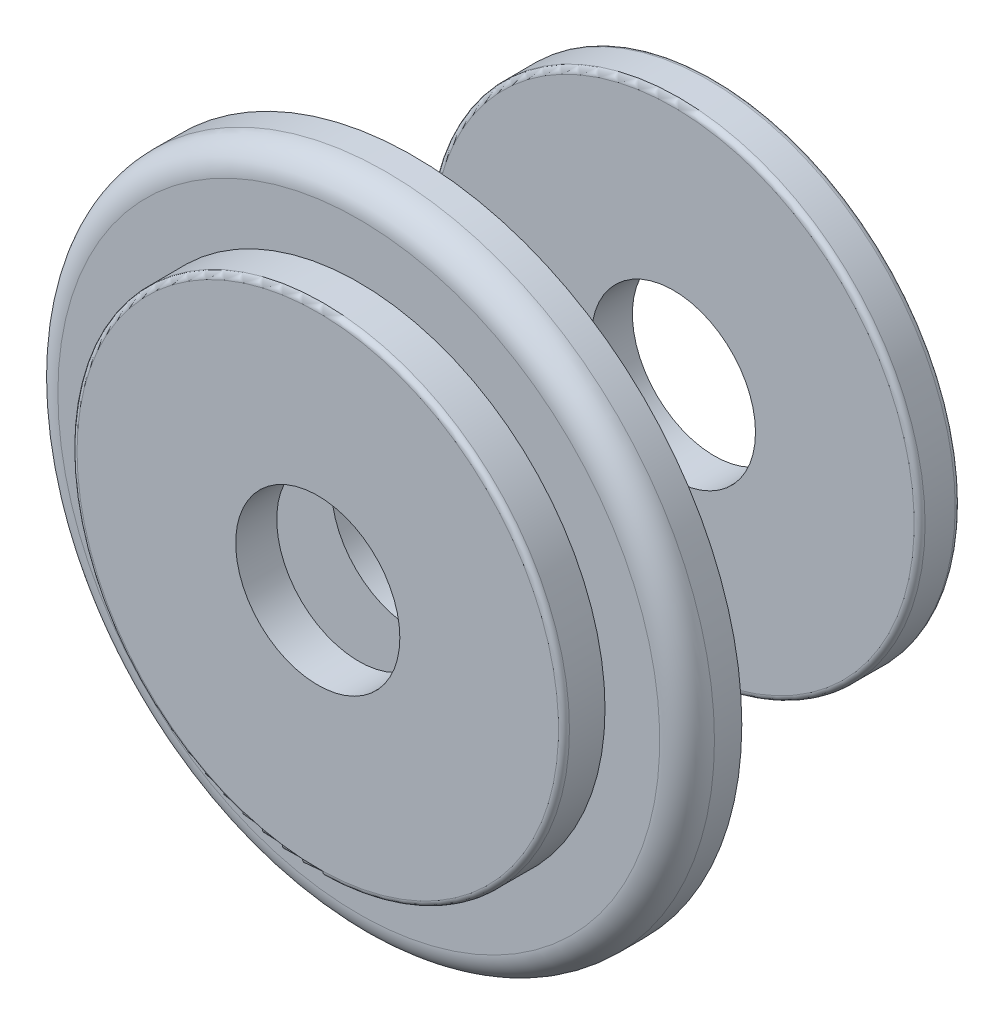
ISO-10303-21;
HEADER;
FILE_DESCRIPTION(('STEP AP214'),'2;1');
FILE_NAME('part.step','',(''),(''),'','','');
FILE_SCHEMA(('AUTOMOTIVE_DESIGN { 1 0 10303 214 1 1 1 1 }'));
ENDSEC;
DATA;
#1=APPLICATION_CONTEXT('core data for automotive mechanical design processes');
#2=APPLICATION_PROTOCOL_DEFINITION('international standard','automotive_design',2000,#1);
#3=PRODUCT_CONTEXT('',#1,'mechanical');
#4=PRODUCT('Part','Part','',(#3));
#5=PRODUCT_RELATED_PRODUCT_CATEGORY('part','',(#4));
#6=PRODUCT_DEFINITION_FORMATION('','',#4);
#7=PRODUCT_DEFINITION_CONTEXT('part definition',#1,'design');
#8=PRODUCT_DEFINITION('design','',#6,#7);
#9=PRODUCT_DEFINITION_SHAPE('','',#8);
#10=(LENGTH_UNIT() NAMED_UNIT(*) SI_UNIT(.MILLI.,.METRE.));
#11=(NAMED_UNIT(*) PLANE_ANGLE_UNIT() SI_UNIT($,.RADIAN.));
#12=(NAMED_UNIT(*) SI_UNIT($,.STERADIAN.) SOLID_ANGLE_UNIT());
#13=UNCERTAINTY_MEASURE_WITH_UNIT(LENGTH_MEASURE(1.E-05),#10,'distance_accuracy_value','');
#14=(GEOMETRIC_REPRESENTATION_CONTEXT(3) GLOBAL_UNCERTAINTY_ASSIGNED_CONTEXT((#13)) GLOBAL_UNIT_ASSIGNED_CONTEXT((#10,
#11,#12)) REPRESENTATION_CONTEXT('',''));
#15=CARTESIAN_POINT('',(0.,0.,0.));
#16=DIRECTION('',(0.,0.,1.));
#17=DIRECTION('',(1.,0.,0.));
#18=AXIS2_PLACEMENT_3D('',#15,#16,#17);
#19=CARTESIAN_POINT('',(0.,0.,20.5));
#20=DIRECTION('',(0.,0.,1.));
#21=DIRECTION('',(1.,0.,0.));
#22=AXIS2_PLACEMENT_3D('',#19,#20,#21);
#23=CYLINDRICAL_SURFACE('',#22,1.5);
#24=CARTESIAN_POINT('',(0.,0.,-4.75));
#25=DIRECTION('',(0.,0.,1.));
#26=DIRECTION('',(1.,0.,0.));
#27=AXIS2_PLACEMENT_3D('',#24,#25,#26);
#28=CIRCLE('',#27,1.5);
#29=CARTESIAN_POINT('',(1.5,0.,-4.75));
#30=VERTEX_POINT('',#29);
#31=EDGE_CURVE('E64',#30,#30,#28,.T.);
#32=ORIENTED_EDGE('',*,*,#31,.F.);
#33=EDGE_LOOP('',(#32));
#34=FACE_BOUND('',#33,.T.);
#35=CARTESIAN_POINT('',(0.,0.,-4.));
#36=DIRECTION('',(0.,0.,1.));
#37=DIRECTION('',(1.,0.,0.));
#38=AXIS2_PLACEMENT_3D('',#35,#36,#37);
#39=CIRCLE('',#38,1.5);
#40=CARTESIAN_POINT('',(1.5,0.,-4.));
#41=VERTEX_POINT('',#40);
#42=EDGE_CURVE('E61',#41,#41,#39,.T.);
#43=ORIENTED_EDGE('',*,*,#42,.T.);
#44=EDGE_LOOP('',(#43));
#45=FACE_BOUND('',#44,.T.);
#46=ADVANCED_FACE('F41',(#34,#45),#23,.F.);
#47=CARTESIAN_POINT('',(0.,1.5,-4.));
#48=DIRECTION('',(0.,0.,-1.));
#49=DIRECTION('',(-1.,0.,0.));
#50=AXIS2_PLACEMENT_3D('',#47,#48,#49);
#51=PLANE('',#50);
#52=CARTESIAN_POINT('',(0.,0.,-4.));
#53=DIRECTION('',(0.,0.,-1.));
#54=DIRECTION('',(-1.,0.,0.));
#55=AXIS2_PLACEMENT_3D('',#52,#53,#54);
#56=CIRCLE('',#55,4.4);
#57=CARTESIAN_POINT('',(-4.4,0.,-4.));
#58=VERTEX_POINT('',#57);
#59=EDGE_CURVE('E11',#58,#58,#56,.F.);
#60=ORIENTED_EDGE('',*,*,#59,.T.);
#61=EDGE_LOOP('',(#60));
#62=FACE_BOUND('',#61,.T.);
#63=ORIENTED_EDGE('',*,*,#42,.F.);
#64=EDGE_LOOP('',(#63));
#65=FACE_BOUND('',#64,.T.);
#66=ADVANCED_FACE('F72',(#62,#65),#51,.F.);
#67=CARTESIAN_POINT('',(0.,0.,20.5));
#68=DIRECTION('',(0.,0.,1.));
#69=DIRECTION('',(1.,0.,0.));
#70=AXIS2_PLACEMENT_3D('',#67,#68,#69);
#71=CYLINDRICAL_SURFACE('',#70,4.5);
#72=CARTESIAN_POINT('',(0.,0.,-4.65));
#73=DIRECTION('',(0.,0.,1.));
#74=DIRECTION('',(1.,0.,0.));
#75=AXIS2_PLACEMENT_3D('',#72,#73,#74);
#76=CIRCLE('',#75,4.5);
#77=CARTESIAN_POINT('',(4.5,0.,-4.65));
#78=VERTEX_POINT('',#77);
#79=EDGE_CURVE('E52',#78,#78,#76,.T.);
#80=ORIENTED_EDGE('',*,*,#79,.T.);
#81=EDGE_LOOP('',(#80));
#82=FACE_BOUND('',#81,.T.);
#83=CARTESIAN_POINT('',(0.,0.,-4.1));
#84=DIRECTION('',(0.,0.,-1.));
#85=DIRECTION('',(-1.,0.,0.));
#86=AXIS2_PLACEMENT_3D('',#83,#84,#85);
#87=CIRCLE('',#86,4.5);
#88=CARTESIAN_POINT('',(-4.5,0.,-4.1));
#89=VERTEX_POINT('',#88);
#90=EDGE_CURVE('E56',#89,#89,#87,.T.);
#91=ORIENTED_EDGE('',*,*,#90,.T.);
#92=EDGE_LOOP('',(#91));
#93=FACE_BOUND('',#92,.T.);
#94=ADVANCED_FACE('F77',(#82,#93),#71,.T.);
#95=CARTESIAN_POINT('',(0.,4.5,-4.75));
#96=DIRECTION('',(0.,0.,1.));
#97=DIRECTION('',(1.,0.,0.));
#98=AXIS2_PLACEMENT_3D('',#95,#96,#97);
#99=PLANE('',#98);
#100=CARTESIAN_POINT('',(0.,0.,-4.75));
#101=DIRECTION('',(0.,0.,1.));
#102=DIRECTION('',(1.,0.,0.));
#103=AXIS2_PLACEMENT_3D('',#100,#101,#102);
#104=CIRCLE('',#103,4.4);
#105=CARTESIAN_POINT('',(4.4,0.,-4.75));
#106=VERTEX_POINT('',#105);
#107=EDGE_CURVE('E48',#106,#106,#104,.F.);
#108=ORIENTED_EDGE('',*,*,#107,.T.);
#109=EDGE_LOOP('',(#108));
#110=FACE_BOUND('',#109,.T.);
#111=ORIENTED_EDGE('',*,*,#31,.T.);
#112=EDGE_LOOP('',(#111));
#113=FACE_BOUND('',#112,.T.);
#114=ADVANCED_FACE('F68',(#110,#113),#99,.F.);
#115=CARTESIAN_POINT('',(0.,0.,-4.65));
#116=DIRECTION('',(0.,0.,1.));
#117=DIRECTION('',(1.,0.,0.));
#118=AXIS2_PLACEMENT_3D('',#115,#116,#117);
#119=TOROIDAL_SURFACE('',#118,4.4,0.1);
#120=ORIENTED_EDGE('',*,*,#107,.F.);
#121=EDGE_LOOP('',(#120));
#122=FACE_BOUND('',#121,.T.);
#123=ORIENTED_EDGE('',*,*,#79,.F.);
#124=EDGE_LOOP('',(#123));
#125=FACE_BOUND('',#124,.T.);
#126=ADVANCED_FACE('F86',(#122,#125),#119,.T.);
#127=CARTESIAN_POINT('',(0.,0.,-4.1));
#128=DIRECTION('',(0.,0.,-1.));
#129=DIRECTION('',(-1.,0.,0.));
#130=AXIS2_PLACEMENT_3D('',#127,#128,#129);
#131=TOROIDAL_SURFACE('',#130,4.4,0.1);
#132=ORIENTED_EDGE('',*,*,#90,.F.);
#133=EDGE_LOOP('',(#132));
#134=FACE_BOUND('',#133,.T.);
#135=ORIENTED_EDGE('',*,*,#59,.F.);
#136=EDGE_LOOP('',(#135));
#137=FACE_BOUND('',#136,.T.);
#138=ADVANCED_FACE('F43',(#134,#137),#131,.T.);
#139=CLOSED_SHELL('',(#46,#66,#94,#114,#126,#138));
#140=MANIFOLD_SOLID_BREP('B2',#139);
#141=CARTESIAN_POINT('',(0.,4.5,0.));
#142=DIRECTION('',(0.,0.,1.));
#143=DIRECTION('',(1.,0.,0.));
#144=AXIS2_PLACEMENT_3D('',#141,#142,#143);
#145=PLANE('',#144);
#146=CARTESIAN_POINT('',(0.,0.,0.));
#147=DIRECTION('',(0.,0.,1.));
#148=DIRECTION('',(1.,0.,0.));
#149=AXIS2_PLACEMENT_3D('',#146,#147,#148);
#150=CIRCLE('',#149,4.4);
#151=CARTESIAN_POINT('',(4.4,0.,0.));
#152=VERTEX_POINT('',#151);
#153=EDGE_CURVE('E143',#152,#152,#150,.F.);
#154=ORIENTED_EDGE('',*,*,#153,.T.);
#155=EDGE_LOOP('',(#154));
#156=FACE_BOUND('',#155,.T.);
#157=CARTESIAN_POINT('',(0.,0.,0.));
#158=DIRECTION('',(0.,0.,1.));
#159=DIRECTION('',(1.,0.,0.));
#160=AXIS2_PLACEMENT_3D('',#157,#158,#159);
#161=CIRCLE('',#160,1.5);
#162=CARTESIAN_POINT('',(1.5,0.,0.));
#163=VERTEX_POINT('',#162);
#164=EDGE_CURVE('E158',#163,#163,#161,.T.);
#165=ORIENTED_EDGE('',*,*,#164,.T.);
#166=EDGE_LOOP('',(#165));
#167=FACE_BOUND('',#166,.T.);
#168=ADVANCED_FACE('F132',(#156,#167),#145,.F.);
#169=CARTESIAN_POINT('',(0.,0.,20.5));
#170=DIRECTION('',(0.,0.,1.));
#171=DIRECTION('',(1.,0.,0.));
#172=AXIS2_PLACEMENT_3D('',#169,#170,#171);
#173=CYLINDRICAL_SURFACE('',#172,1.5);
#174=ORIENTED_EDGE('',*,*,#164,.F.);
#175=EDGE_LOOP('',(#174));
#176=FACE_BOUND('',#175,.T.);
#177=CARTESIAN_POINT('',(0.,0.,0.750000000000001));
#178=DIRECTION('',(0.,0.,1.));
#179=DIRECTION('',(1.,0.,0.));
#180=AXIS2_PLACEMENT_3D('',#177,#178,#179);
#181=CIRCLE('',#180,1.5);
#182=CARTESIAN_POINT('',(1.5,0.,0.750000000000001));
#183=VERTEX_POINT('',#182);
#184=EDGE_CURVE('E161',#183,#183,#181,.T.);
#185=ORIENTED_EDGE('',*,*,#184,.T.);
#186=EDGE_LOOP('',(#185));
#187=FACE_BOUND('',#186,.T.);
#188=ADVANCED_FACE('F206',(#176,#187),#173,.F.);
#189=CARTESIAN_POINT('',(0.,1.5,0.750000000000001));
#190=DIRECTION('',(0.,0.,-1.));
#191=DIRECTION('',(-1.,0.,0.));
#192=AXIS2_PLACEMENT_3D('',#189,#190,#191);
#193=PLANE('',#192);
#194=ORIENTED_EDGE('',*,*,#184,.F.);
#195=EDGE_LOOP('',(#194));
#196=FACE_BOUND('',#195,.T.);
#197=CARTESIAN_POINT('',(0.,0.,0.750000000000001));
#198=DIRECTION('',(0.,0.,1.));
#199=DIRECTION('',(1.,0.,0.));
#200=AXIS2_PLACEMENT_3D('',#197,#198,#199);
#201=CIRCLE('',#200,3.);
#202=CARTESIAN_POINT('',(3.,0.,0.750000000000001));
#203=VERTEX_POINT('',#202);
#204=EDGE_CURVE('E164',#203,#203,#201,.T.);
#205=ORIENTED_EDGE('',*,*,#204,.T.);
#206=EDGE_LOOP('',(#205));
#207=FACE_BOUND('',#206,.T.);
#208=ADVANCED_FACE('F214',(#196,#207),#193,.F.);
#209=CARTESIAN_POINT('',(0.,0.,20.5));
#210=DIRECTION('',(0.,0.,1.));
#211=DIRECTION('',(1.,0.,0.));
#212=AXIS2_PLACEMENT_3D('',#209,#210,#211);
#213=CYLINDRICAL_SURFACE('',#212,3.);
#214=ORIENTED_EDGE('',*,*,#204,.F.);
#215=EDGE_LOOP('',(#214));
#216=FACE_BOUND('',#215,.T.);
#217=CARTESIAN_POINT('',(0.,0.,1.75));
#218=DIRECTION('',(0.,0.,1.));
#219=DIRECTION('',(1.,0.,0.));
#220=AXIS2_PLACEMENT_3D('',#217,#218,#219);
#221=CIRCLE('',#220,3.);
#222=CARTESIAN_POINT('',(3.,0.,1.75));
#223=VERTEX_POINT('',#222);
#224=EDGE_CURVE('E167',#223,#223,#221,.T.);
#225=ORIENTED_EDGE('',*,*,#224,.T.);
#226=EDGE_LOOP('',(#225));
#227=FACE_BOUND('',#226,.T.);
#228=ADVANCED_FACE('F301',(#216,#227),#213,.F.);
#229=CARTESIAN_POINT('',(0.,3.,1.75));
#230=DIRECTION('',(0.,0.,1.));
#231=DIRECTION('',(1.,0.,0.));
#232=AXIS2_PLACEMENT_3D('',#229,#230,#231);
#233=PLANE('',#232);
#234=ORIENTED_EDGE('',*,*,#224,.F.);
#235=EDGE_LOOP('',(#234));
#236=FACE_BOUND('',#235,.T.);
#237=CARTESIAN_POINT('',(0.,0.,1.75));
#238=DIRECTION('',(0.,0.,1.));
#239=DIRECTION('',(1.,0.,0.));
#240=AXIS2_PLACEMENT_3D('',#237,#238,#239);
#241=CIRCLE('',#240,1.5);
#242=CARTESIAN_POINT('',(1.5,0.,1.75));
#243=VERTEX_POINT('',#242);
#244=EDGE_CURVE('E170',#243,#243,#241,.T.);
#245=ORIENTED_EDGE('',*,*,#244,.T.);
#246=EDGE_LOOP('',(#245));
#247=FACE_BOUND('',#246,.T.);
#248=ADVANCED_FACE('F292',(#236,#247),#233,.F.);
#249=CARTESIAN_POINT('',(0.,0.,20.5));
#250=DIRECTION('',(0.,0.,1.));
#251=DIRECTION('',(1.,0.,0.));
#252=AXIS2_PLACEMENT_3D('',#249,#250,#251);
#253=CYLINDRICAL_SURFACE('',#252,1.5);
#254=ORIENTED_EDGE('',*,*,#244,.F.);
#255=EDGE_LOOP('',(#254));
#256=FACE_BOUND('',#255,.T.);
#257=CARTESIAN_POINT('',(0.,0.,2.5));
#258=DIRECTION('',(0.,0.,1.));
#259=DIRECTION('',(1.,0.,0.));
#260=AXIS2_PLACEMENT_3D('',#257,#258,#259);
#261=CIRCLE('',#260,1.5);
#262=CARTESIAN_POINT('',(1.5,0.,2.5));
#263=VERTEX_POINT('',#262);
#264=EDGE_CURVE('E173',#263,#263,#261,.T.);
#265=ORIENTED_EDGE('',*,*,#264,.T.);
#266=EDGE_LOOP('',(#265));
#267=FACE_BOUND('',#266,.T.);
#268=ADVANCED_FACE('F285',(#256,#267),#253,.F.);
#269=CARTESIAN_POINT('',(0.,1.5,2.5));
#270=DIRECTION('',(0.,0.,-1.));
#271=DIRECTION('',(-1.,0.,0.));
#272=AXIS2_PLACEMENT_3D('',#269,#270,#271);
#273=PLANE('',#272);
#274=CARTESIAN_POINT('',(0.,0.,2.5));
#275=DIRECTION('',(0.,0.,-1.));
#276=DIRECTION('',(-1.,0.,0.));
#277=AXIS2_PLACEMENT_3D('',#274,#275,#276);
#278=CIRCLE('',#277,4.4);
#279=CARTESIAN_POINT('',(-4.4,0.,2.5));
#280=VERTEX_POINT('',#279);
#281=EDGE_CURVE('E139',#280,#280,#278,.F.);
#282=ORIENTED_EDGE('',*,*,#281,.T.);
#283=EDGE_LOOP('',(#282));
#284=FACE_BOUND('',#283,.T.);
#285=ORIENTED_EDGE('',*,*,#264,.F.);
#286=EDGE_LOOP('',(#285));
#287=FACE_BOUND('',#286,.T.);
#288=ADVANCED_FACE('F278',(#284,#287),#273,.F.);
#289=CARTESIAN_POINT('',(0.,0.,20.5));
#290=DIRECTION('',(0.,0.,1.));
#291=DIRECTION('',(1.,0.,0.));
#292=AXIS2_PLACEMENT_3D('',#289,#290,#291);
#293=CYLINDRICAL_SURFACE('',#292,4.5);
#294=CARTESIAN_POINT('',(0.,0.,2.4));
#295=DIRECTION('',(0.,0.,-1.));
#296=DIRECTION('',(-1.,0.,0.));
#297=AXIS2_PLACEMENT_3D('',#294,#295,#296);
#298=CIRCLE('',#297,4.5);
#299=CARTESIAN_POINT('',(-4.5,0.,2.4));
#300=VERTEX_POINT('',#299);
#301=EDGE_CURVE('E40',#300,#300,#298,.T.);
#302=ORIENTED_EDGE('',*,*,#301,.T.);
#303=EDGE_LOOP('',(#302));
#304=FACE_BOUND('',#303,.T.);
#305=CARTESIAN_POINT('',(0.,0.,1.75));
#306=DIRECTION('',(0.,0.,1.));
#307=DIRECTION('',(1.,0.,0.));
#308=AXIS2_PLACEMENT_3D('',#305,#306,#307);
#309=CIRCLE('',#308,4.5);
#310=CARTESIAN_POINT('',(4.5,0.,1.75));
#311=VERTEX_POINT('',#310);
#312=EDGE_CURVE('E176',#311,#311,#309,.T.);
#313=ORIENTED_EDGE('',*,*,#312,.T.);
#314=EDGE_LOOP('',(#313));
#315=FACE_BOUND('',#314,.T.);
#316=ADVANCED_FACE('F269',(#304,#315),#293,.T.);
#317=CARTESIAN_POINT('',(0.,4.5,1.75));
#318=DIRECTION('',(0.,0.,-1.));
#319=DIRECTION('',(-1.,0.,0.));
#320=AXIS2_PLACEMENT_3D('',#317,#318,#319);
#321=PLANE('',#320);
#322=CARTESIAN_POINT('',(0.,0.,1.75));
#323=DIRECTION('',(0.,0.,-1.));
#324=DIRECTION('',(-1.,0.,0.));
#325=AXIS2_PLACEMENT_3D('',#322,#323,#324);
#326=CIRCLE('',#325,5.5);
#327=CARTESIAN_POINT('',(-5.5,0.,1.75));
#328=VERTEX_POINT('',#327);
#329=EDGE_CURVE('E155',#328,#328,#326,.F.);
#330=ORIENTED_EDGE('',*,*,#329,.T.);
#331=EDGE_LOOP('',(#330));
#332=FACE_BOUND('',#331,.T.);
#333=ORIENTED_EDGE('',*,*,#312,.F.);
#334=EDGE_LOOP('',(#333));
#335=FACE_BOUND('',#334,.T.);
#336=ADVANCED_FACE('F260',(#332,#335),#321,.F.);
#337=CARTESIAN_POINT('',(0.,0.,20.5));
#338=DIRECTION('',(0.,0.,1.));
#339=DIRECTION('',(1.,0.,0.));
#340=AXIS2_PLACEMENT_3D('',#337,#338,#339);
#341=CYLINDRICAL_SURFACE('',#340,6.);
#342=CARTESIAN_POINT('',(0.,0.,1.25));
#343=DIRECTION('',(0.,0.,-1.));
#344=DIRECTION('',(-1.,0.,0.));
#345=AXIS2_PLACEMENT_3D('',#342,#343,#344);
#346=CIRCLE('',#345,6.);
#347=CARTESIAN_POINT('',(-6.,0.,1.25));
#348=VERTEX_POINT('',#347);
#349=EDGE_CURVE('E152',#348,#348,#346,.T.);
#350=ORIENTED_EDGE('',*,*,#349,.T.);
#351=EDGE_LOOP('',(#350));
#352=FACE_BOUND('',#351,.T.);
#353=CARTESIAN_POINT('',(0.,0.,0.750000000000001));
#354=DIRECTION('',(0.,0.,1.));
#355=DIRECTION('',(1.,0.,0.));
#356=AXIS2_PLACEMENT_3D('',#353,#354,#355);
#357=CIRCLE('',#356,6.);
#358=CARTESIAN_POINT('',(6.,0.,0.750000000000001));
#359=VERTEX_POINT('',#358);
#360=EDGE_CURVE('E179',#359,#359,#357,.T.);
#361=ORIENTED_EDGE('',*,*,#360,.T.);
#362=EDGE_LOOP('',(#361));
#363=FACE_BOUND('',#362,.T.);
#364=ADVANCED_FACE('F202',(#352,#363),#341,.T.);
#365=CARTESIAN_POINT('',(0.,6.,0.750000000000002));
#366=DIRECTION('',(0.,0.,1.));
#367=DIRECTION('',(1.,0.,0.));
#368=AXIS2_PLACEMENT_3D('',#365,#366,#367);
#369=PLANE('',#368);
#370=ORIENTED_EDGE('',*,*,#360,.F.);
#371=EDGE_LOOP('',(#370));
#372=FACE_BOUND('',#371,.T.);
#373=CARTESIAN_POINT('',(0.,0.,0.750000000000001));
#374=DIRECTION('',(0.,0.,1.));
#375=DIRECTION('',(1.,0.,0.));
#376=AXIS2_PLACEMENT_3D('',#373,#374,#375);
#377=CIRCLE('',#376,4.5);
#378=CARTESIAN_POINT('',(4.5,0.,0.750000000000001));
#379=VERTEX_POINT('',#378);
#380=EDGE_CURVE('E182',#379,#379,#377,.T.);
#381=ORIENTED_EDGE('',*,*,#380,.T.);
#382=EDGE_LOOP('',(#381));
#383=FACE_BOUND('',#382,.T.);
#384=ADVANCED_FACE('F186',(#372,#383),#369,.F.);
#385=CARTESIAN_POINT('',(0.,0.,20.5));
#386=DIRECTION('',(0.,0.,1.));
#387=DIRECTION('',(1.,0.,0.));
#388=AXIS2_PLACEMENT_3D('',#385,#386,#387);
#389=CYLINDRICAL_SURFACE('',#388,4.5);
#390=CARTESIAN_POINT('',(0.,0.,0.0999999999999994));
#391=DIRECTION('',(0.,0.,1.));
#392=DIRECTION('',(1.,0.,0.));
#393=AXIS2_PLACEMENT_3D('',#390,#391,#392);
#394=CIRCLE('',#393,4.5);
#395=CARTESIAN_POINT('',(4.5,0.,0.0999999999999994));
#396=VERTEX_POINT('',#395);
#397=EDGE_CURVE('E147',#396,#396,#394,.T.);
#398=ORIENTED_EDGE('',*,*,#397,.T.);
#399=EDGE_LOOP('',(#398));
#400=FACE_BOUND('',#399,.T.);
#401=ORIENTED_EDGE('',*,*,#380,.F.);
#402=EDGE_LOOP('',(#401));
#403=FACE_BOUND('',#402,.T.);
#404=ADVANCED_FACE('F188',(#400,#403),#389,.T.);
#405=CARTESIAN_POINT('',(0.,0.,1.25));
#406=DIRECTION('',(0.,0.,-1.));
#407=DIRECTION('',(-1.,0.,0.));
#408=AXIS2_PLACEMENT_3D('',#405,#406,#407);
#409=TOROIDAL_SURFACE('',#408,5.5,0.5);
#410=ORIENTED_EDGE('',*,*,#349,.F.);
#411=EDGE_LOOP('',(#410));
#412=FACE_BOUND('',#411,.T.);
#413=ORIENTED_EDGE('',*,*,#329,.F.);
#414=EDGE_LOOP('',(#413));
#415=FACE_BOUND('',#414,.T.);
#416=ADVANCED_FACE('F190',(#412,#415),#409,.T.);
#417=CARTESIAN_POINT('',(0.,0.,0.0999999999999994));
#418=DIRECTION('',(0.,0.,1.));
#419=DIRECTION('',(1.,0.,0.));
#420=AXIS2_PLACEMENT_3D('',#417,#418,#419);
#421=TOROIDAL_SURFACE('',#420,4.4,0.1);
#422=ORIENTED_EDGE('',*,*,#153,.F.);
#423=EDGE_LOOP('',(#422));
#424=FACE_BOUND('',#423,.T.);
#425=ORIENTED_EDGE('',*,*,#397,.F.);
#426=EDGE_LOOP('',(#425));
#427=FACE_BOUND('',#426,.T.);
#428=ADVANCED_FACE('F198',(#424,#427),#421,.T.);
#429=CARTESIAN_POINT('',(0.,0.,2.4));
#430=DIRECTION('',(0.,0.,-1.));
#431=DIRECTION('',(-1.,0.,0.));
#432=AXIS2_PLACEMENT_3D('',#429,#430,#431);
#433=TOROIDAL_SURFACE('',#432,4.4,0.1);
#434=ORIENTED_EDGE('',*,*,#301,.F.);
#435=EDGE_LOOP('',(#434));
#436=FACE_BOUND('',#435,.T.);
#437=ORIENTED_EDGE('',*,*,#281,.F.);
#438=EDGE_LOOP('',(#437));
#439=FACE_BOUND('',#438,.T.);
#440=ADVANCED_FACE('F134',(#436,#439),#433,.T.);
#441=CLOSED_SHELL('',(#168,#188,#208,#228,#248,#268,#288,#316,#336,#364,#384,#404,#416,#428,#440));
#442=MANIFOLD_SOLID_BREP('B6',#441);
#443=ADVANCED_BREP_SHAPE_REPRESENTATION('',(#18,#140,#442),#14);
#444=SHAPE_DEFINITION_REPRESENTATION(#9,#443);
ENDSEC;
END-ISO-10303-21;
